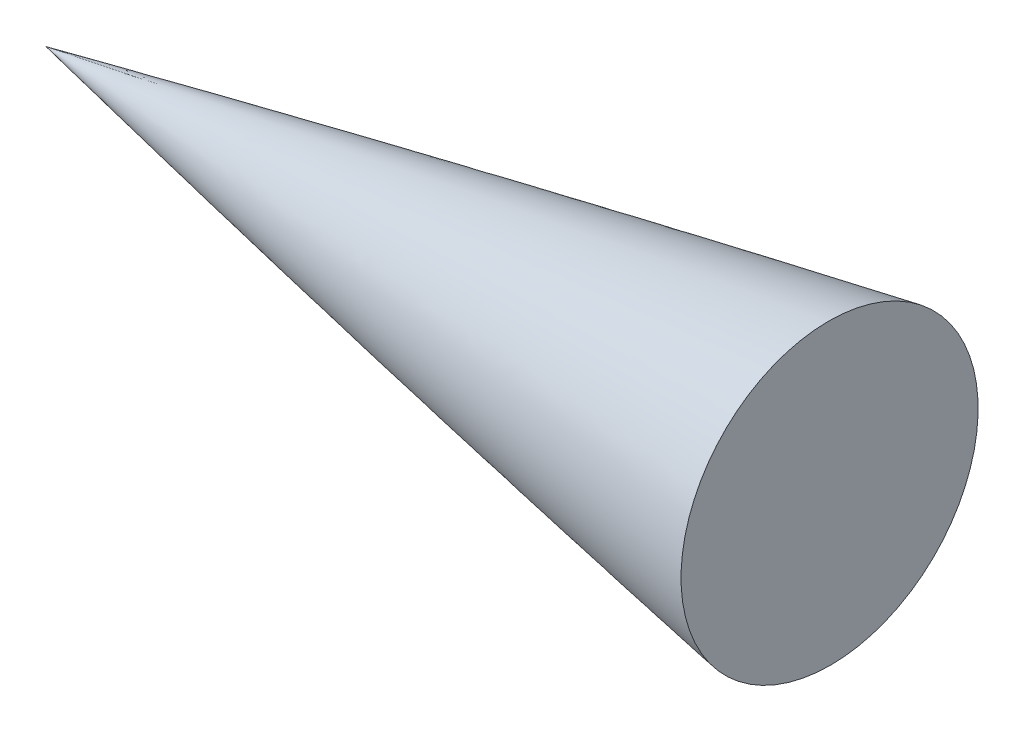
ISO-10303-21;
HEADER;
FILE_DESCRIPTION(('STEP AP214'),'2;1');
FILE_NAME('part.step','',(''),(''),'','','');
FILE_SCHEMA(('AUTOMOTIVE_DESIGN { 1 0 10303 214 1 1 1 1 }'));
ENDSEC;
DATA;
#1=APPLICATION_CONTEXT('core data for automotive mechanical design processes');
#2=APPLICATION_PROTOCOL_DEFINITION('international standard','automotive_design',2000,#1);
#3=PRODUCT_CONTEXT('',#1,'mechanical');
#4=PRODUCT('Part','Part','',(#3));
#5=PRODUCT_RELATED_PRODUCT_CATEGORY('part','',(#4));
#6=PRODUCT_DEFINITION_FORMATION('','',#4);
#7=PRODUCT_DEFINITION_CONTEXT('part definition',#1,'design');
#8=PRODUCT_DEFINITION('design','',#6,#7);
#9=PRODUCT_DEFINITION_SHAPE('','',#8);
#10=(LENGTH_UNIT() NAMED_UNIT(*) SI_UNIT(.MILLI.,.METRE.));
#11=(NAMED_UNIT(*) PLANE_ANGLE_UNIT() SI_UNIT($,.RADIAN.));
#12=(NAMED_UNIT(*) SI_UNIT($,.STERADIAN.) SOLID_ANGLE_UNIT());
#13=UNCERTAINTY_MEASURE_WITH_UNIT(LENGTH_MEASURE(1.E-05),#10,'distance_accuracy_value','');
#14=(GEOMETRIC_REPRESENTATION_CONTEXT(3) GLOBAL_UNCERTAINTY_ASSIGNED_CONTEXT((#13)) GLOBAL_UNIT_ASSIGNED_CONTEXT((#10,
#11,#12)) REPRESENTATION_CONTEXT('',''));
#15=CARTESIAN_POINT('',(0.,0.,0.));
#16=DIRECTION('',(0.,0.,1.));
#17=DIRECTION('',(1.,0.,0.));
#18=AXIS2_PLACEMENT_3D('',#15,#16,#17);
#19=CARTESIAN_POINT('',(99.9999999983632,19.6229123827662,0.));
#20=CARTESIAN_POINT('',(99.0044566143059,19.4420092366943,0.));
#21=CARTESIAN_POINT('',(97.0662265627241,19.0887105018796,0.));
#22=CARTESIAN_POINT('',(92.1897911106648,18.1976627119741,0.));
#23=CARTESIAN_POINT('',(88.455319076475,17.505888239135,0.));
#24=CARTESIAN_POINT('',(83.0611649620969,16.5059586545598,0.));
#25=CARTESIAN_POINT('',(78.6671065794459,15.6811505455532,0.));
#26=CARTESIAN_POINT('',(73.6712742197575,14.7404512974783,0.));
#27=CARTESIAN_POINT('',(69.040307638683,13.8593984952589,0.));
#28=CARTESIAN_POINT('',(64.1927034573583,12.9325135832059,0.));
#29=CARTESIAN_POINT('',(59.4741729054533,12.022306057198,0.));
#30=CARTESIAN_POINT('',(54.6863054545051,11.0932352439869,0.));
#31=CARTESIAN_POINT('',(49.9310090329164,10.162972858734,0.));
#32=CARTESIAN_POINT('',(45.1768497037998,9.22720326797881,0.));
#33=CARTESIAN_POINT('',(40.3928626324417,8.27799682425439,0.));
#34=CARTESIAN_POINT('',(35.6803665367913,7.33756348358118,0.));
#35=CARTESIAN_POINT('',(30.8418109281739,6.36373960573934,0.));
#36=CARTESIAN_POINT('',(26.2215560002765,5.42943691599559,0.));
#37=CARTESIAN_POINT('',(21.2402874391555,4.4123324254869,0.));
#38=CARTESIAN_POINT('',(16.8610495877299,3.51557410989583,0.));
#39=CARTESIAN_POINT('',(11.4879353764823,2.40263616329231,0.));
#40=CARTESIAN_POINT('',(7.77067395148692,1.63218834724657,0.));
#41=CARTESIAN_POINT('',(2.91732185086174,0.613942146990198,0.));
#42=CARTESIAN_POINT('',(0.990082122194799,0.208734407869014,0.));
#43=CARTESIAN_POINT('',(-1.73871052104591E-09,-3.66566071116972E-10,0.));
#44=B_SPLINE_CURVE_WITH_KNOTS('',4,(#19,#20,#21,#22,#23,#24,#25,#26,#27,#28,#29,#30,#31,#32,#33,
#34,#35,#36,#37,#38,#39,#40,#41,#42,#43),.UNSPECIFIED.,.F.,.F.,(5,1,1,1,1,1,1,1,1,1,1,1,1,1,1,1,
1,1,1,1,1,5),(0.0828252696889207,0.122540379504272,0.162255490052107,0.201970601118601,
0.241685710988392,0.281400821521106,0.321115932681323,0.360831042556165,0.400546152941936,
0.440261263877824,0.479976373746749,0.519691484161193,0.559406595149374,0.599121705121737,
0.638836815709851,0.678551926950931,0.718267036989635,0.7579821473117,0.79769725817116,
0.837412368077128,0.877127478749061,0.916842590227155),.UNSPECIFIED.);
#45=CARTESIAN_POINT('',(0.,0.,0.));
#46=DIRECTION('',(-0.999979333824038,-0.00642899096544053,0.));
#47=AXIS1_PLACEMENT('',#45,#46);
#48=SURFACE_OF_REVOLUTION('',#44,#47);
#49=CARTESIAN_POINT('',(0.,0.,0.));
#50=VERTEX_POINT('',#49);
#51=VERTEX_LOOP('',#50);
#52=FACE_BOUND('',#51,.T.);
#53=CARTESIAN_POINT('',(100.122019726902,0.643696863018549,0.));
#54=DIRECTION('',(-0.999979333824038,-0.00642899096544053,0.));
#55=DIRECTION('',(0.00642899096544053,-0.999979333824038,0.));
#56=AXIS2_PLACEMENT_3D('',#53,#54,#55);
#57=CIRCLE('',#56,18.9796077559802);
#58=CARTESIAN_POINT('',(100.244039453693,-18.335518657048,0.));
#59=VERTEX_POINT('',#58);
#60=EDGE_CURVE('E11',#59,#59,#57,.T.);
#61=ORIENTED_EDGE('',*,*,#60,.T.);
#62=EDGE_LOOP('',(#61));
#63=FACE_BOUND('',#62,.T.);
#64=ADVANCED_FACE('F34',(#52,#63),#48,.T.);
#65=CARTESIAN_POINT('',(100.000000000111,0.642912383085205,0.));
#66=DIRECTION('',(0.999979333824038,0.00642899096544053,0.));
#67=DIRECTION('',(-0.00642899096544053,0.999979333824038,0.));
#68=AXIS2_PLACEMENT_3D('',#65,#66,#67);
#69=CONICAL_SURFACE('',#68,0.,1.56436729154154);
#70=ORIENTED_EDGE('',*,*,#60,.F.);
#71=EDGE_LOOP('',(#70));
#72=FACE_BOUND('',#71,.T.);
#73=CARTESIAN_POINT('',(100.000000000111,0.642912383085205,0.));
#74=VERTEX_POINT('',#73);
#75=VERTEX_LOOP('',#74);
#76=FACE_BOUND('',#75,.T.);
#77=ADVANCED_FACE('F48',(#72,#76),#69,.F.);
#78=CLOSED_SHELL('',(#64,#77));
#79=MANIFOLD_SOLID_BREP('B2',#78);
#80=ADVANCED_BREP_SHAPE_REPRESENTATION('',(#18,#79),#14);
#81=SHAPE_DEFINITION_REPRESENTATION(#9,#80);
ENDSEC;
END-ISO-10303-21;
